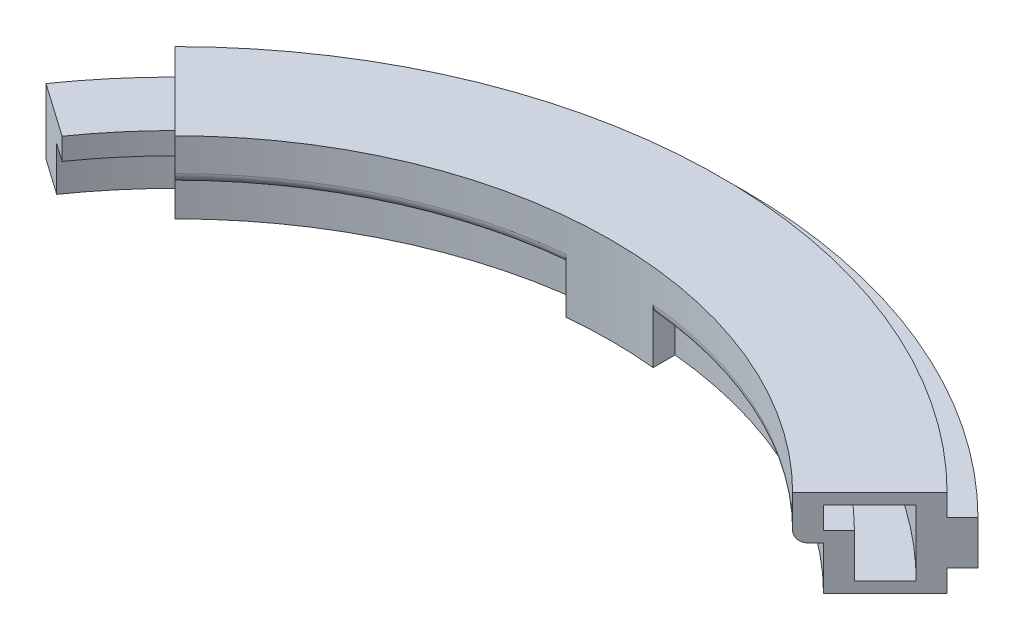
ISO-10303-21;
HEADER;
FILE_DESCRIPTION(('STEP AP214'),'2;1');
FILE_NAME('part.step','',(''),(''),'','','');
FILE_SCHEMA(('AUTOMOTIVE_DESIGN { 1 0 10303 214 1 1 1 1 }'));
ENDSEC;
DATA;
#1=APPLICATION_CONTEXT('core data for automotive mechanical design processes');
#2=APPLICATION_PROTOCOL_DEFINITION('international standard','automotive_design',2000,#1);
#3=PRODUCT_CONTEXT('',#1,'mechanical');
#4=PRODUCT('Part','Part','',(#3));
#5=PRODUCT_RELATED_PRODUCT_CATEGORY('part','',(#4));
#6=PRODUCT_DEFINITION_FORMATION('','',#4);
#7=PRODUCT_DEFINITION_CONTEXT('part definition',#1,'design');
#8=PRODUCT_DEFINITION('design','',#6,#7);
#9=PRODUCT_DEFINITION_SHAPE('','',#8);
#10=(LENGTH_UNIT() NAMED_UNIT(*) SI_UNIT(.MILLI.,.METRE.));
#11=(NAMED_UNIT(*) PLANE_ANGLE_UNIT() SI_UNIT($,.RADIAN.));
#12=(NAMED_UNIT(*) SI_UNIT($,.STERADIAN.) SOLID_ANGLE_UNIT());
#13=UNCERTAINTY_MEASURE_WITH_UNIT(LENGTH_MEASURE(1.E-05),#10,'distance_accuracy_value','');
#14=(GEOMETRIC_REPRESENTATION_CONTEXT(3) GLOBAL_UNCERTAINTY_ASSIGNED_CONTEXT((#13)) GLOBAL_UNIT_ASSIGNED_CONTEXT((#10,
#11,#12)) REPRESENTATION_CONTEXT('',''));
#15=CARTESIAN_POINT('',(0.,0.,0.));
#16=DIRECTION('',(0.,0.,1.));
#17=DIRECTION('',(1.,0.,0.));
#18=AXIS2_PLACEMENT_3D('',#15,#16,#17);
#19=CARTESIAN_POINT('',(0.,10.,0.));
#20=DIRECTION('',(0.,-1.,0.));
#21=DIRECTION('',(0.,0.,-1.));
#22=AXIS2_PLACEMENT_3D('',#19,#20,#21);
#23=CYLINDRICAL_SURFACE('',#22,125.);
#24=CARTESIAN_POINT('',(0.,5.00000000000001,0.));
#25=DIRECTION('',(0.,1.,0.));
#26=DIRECTION('',(0.,0.,1.));
#27=AXIS2_PLACEMENT_3D('',#24,#25,#26);
#28=CIRCLE('',#27,125.);
#29=CARTESIAN_POINT('',(88.3883476483183,5.00000000000001,-88.3883476483186));
#30=VERTEX_POINT('',#29);
#31=CARTESIAN_POINT('',(-88.3883476483189,5.00000000000001,-88.388347648318));
#32=VERTEX_POINT('',#31);
#33=EDGE_CURVE('E236',#30,#32,#28,.T.);
#34=ORIENTED_EDGE('',*,*,#33,.F.);
#35=DIRECTION('',(0.,-1.,0.));
#36=VECTOR('',#35,1.);
#37=CARTESIAN_POINT('',(88.3883476483189,10.,-88.388347648318));
#38=LINE('',#37,#36);
#39=CARTESIAN_POINT('',(88.3883476483189,0.,-88.388347648318));
#40=VERTEX_POINT('',#39);
#41=EDGE_CURVE('E420',#30,#40,#38,.T.);
#42=ORIENTED_EDGE('',*,*,#41,.T.);
#43=CARTESIAN_POINT('',(0.,0.,0.));
#44=DIRECTION('',(0.,1.,0.));
#45=DIRECTION('',(0.,0.,1.));
#46=AXIS2_PLACEMENT_3D('',#43,#44,#45);
#47=CIRCLE('',#46,125.);
#48=CARTESIAN_POINT('',(-88.3883476483189,0.,-88.388347648318));
#49=VERTEX_POINT('',#48);
#50=EDGE_CURVE('E410',#40,#49,#47,.T.);
#51=ORIENTED_EDGE('',*,*,#50,.T.);
#52=DIRECTION('',(0.,-1.,0.));
#53=VECTOR('',#52,1.);
#54=CARTESIAN_POINT('',(-88.3883476483189,10.,-88.388347648318));
#55=LINE('',#54,#53);
#56=EDGE_CURVE('E417',#32,#49,#55,.T.);
#57=ORIENTED_EDGE('',*,*,#56,.F.);
#58=EDGE_LOOP('',(#34,#42,#51,#57));
#59=FACE_BOUND('',#58,.T.);
#60=ADVANCED_FACE('F36',(#59),#23,.T.);
#61=CARTESIAN_POINT('',(0.,10.,0.));
#62=DIRECTION('',(-0.707106781186544,0.,-0.707106781186551));
#63=DIRECTION('',(-0.707106781186551,0.,0.707106781186544));
#64=AXIS2_PLACEMENT_3D('',#61,#62,#63);
#65=PLANE('',#64);
#66=DIRECTION('',(0.,-1.,0.));
#67=VECTOR('',#66,1.);
#68=CARTESIAN_POINT('',(70.7106781186551,20.,-70.7106781186544));
#69=LINE('',#68,#67);
#70=CARTESIAN_POINT('',(70.7106781186551,20.,-70.7106781186544));
#71=VERTEX_POINT('',#70);
#72=CARTESIAN_POINT('',(70.7106781186551,12.5,-70.7106781186544));
#73=VERTEX_POINT('',#72);
#74=EDGE_CURVE('E377',#71,#73,#69,.T.);
#75=ORIENTED_EDGE('',*,*,#74,.T.);
#76=CARTESIAN_POINT('',(72.4784450716215,12.5,-72.4784450716208));
#77=DIRECTION('',(-0.707106781186544,0.,-0.707106781186551));
#78=DIRECTION('',(-0.707106781186551,0.,0.707106781186544));
#79=AXIS2_PLACEMENT_3D('',#76,#77,#78);
#80=CIRCLE('',#79,2.5);
#81=CARTESIAN_POINT('',(72.4784450716215,10.,-72.4784450716208));
#82=VERTEX_POINT('',#81);
#83=EDGE_CURVE('E65',#73,#82,#80,.F.);
#84=ORIENTED_EDGE('',*,*,#83,.T.);
#85=DIRECTION('',(0.707106781186551,0.,-0.707106781186544));
#86=VECTOR('',#85,1.);
#87=CARTESIAN_POINT('',(0.,10.,0.));
#88=LINE('',#87,#86);
#89=CARTESIAN_POINT('',(74.2462120245878,10.,-74.2462120245872));
#90=VERTEX_POINT('',#89);
#91=EDGE_CURVE('E369',#82,#90,#88,.T.);
#92=ORIENTED_EDGE('',*,*,#91,.T.);
#93=DIRECTION('',(0.,-1.,0.));
#94=VECTOR('',#93,1.);
#95=CARTESIAN_POINT('',(74.2462120245878,10.,-74.2462120245872));
#96=LINE('',#95,#94);
#97=CARTESIAN_POINT('',(74.2462120245878,0.,-74.2462120245872));
#98=VERTEX_POINT('',#97);
#99=EDGE_CURVE('E424',#90,#98,#96,.T.);
#100=ORIENTED_EDGE('',*,*,#99,.T.);
#101=DIRECTION('',(0.707106781186551,0.,-0.707106781186544));
#102=VECTOR('',#101,1.);
#103=CARTESIAN_POINT('',(0.,0.,0.));
#104=LINE('',#103,#102);
#105=EDGE_CURVE('E407',#98,#40,#104,.T.);
#106=ORIENTED_EDGE('',*,*,#105,.T.);
#107=ORIENTED_EDGE('',*,*,#41,.F.);
#108=DIRECTION('',(0.707106781186546,0.,-0.707106781186549));
#109=VECTOR('',#108,1.);
#110=CARTESIAN_POINT('',(0.,5.00000000000002,0.));
#111=LINE('',#110,#109);
#112=CARTESIAN_POINT('',(91.923881554251,5.00000000000001,-91.9238815542513));
#113=VERTEX_POINT('',#112);
#114=EDGE_CURVE('E256',#30,#113,#111,.T.);
#115=ORIENTED_EDGE('',*,*,#114,.T.);
#116=DIRECTION('',(0.,1.,0.));
#117=VECTOR('',#116,1.);
#118=CARTESIAN_POINT('',(91.923881554251,0.,-91.9238815542513));
#119=LINE('',#118,#117);
#120=CARTESIAN_POINT('',(91.923881554251,15.,-91.9238815542513));
#121=VERTEX_POINT('',#120);
#122=EDGE_CURVE('E233',#113,#121,#119,.T.);
#123=ORIENTED_EDGE('',*,*,#122,.T.);
#124=DIRECTION('',(0.707106781186546,0.,-0.707106781186549));
#125=VECTOR('',#124,1.);
#126=CARTESIAN_POINT('',(0.,15.,0.));
#127=LINE('',#126,#125);
#128=CARTESIAN_POINT('',(88.3883476483183,15.,-88.3883476483186));
#129=VERTEX_POINT('',#128);
#130=EDGE_CURVE('E237',#129,#121,#127,.T.);
#131=ORIENTED_EDGE('',*,*,#130,.F.);
#132=CARTESIAN_POINT('',(88.3883476483188,20.,-88.388347648318));
#133=VERTEX_POINT('',#132);
#134=EDGE_CURVE('E421',#133,#129,#38,.T.);
#135=ORIENTED_EDGE('',*,*,#134,.F.);
#136=DIRECTION('',(0.707106781186551,0.,-0.707106781186544));
#137=VECTOR('',#136,1.);
#138=CARTESIAN_POINT('',(0.,20.,0.));
#139=LINE('',#138,#137);
#140=EDGE_CURVE('E371',#71,#133,#139,.T.);
#141=ORIENTED_EDGE('',*,*,#140,.F.);
#142=EDGE_LOOP('',(#75,#84,#92,#100,#106,#107,#115,#123,#131,#135,#141));
#143=FACE_BOUND('',#142,.T.);
#144=DIRECTION('',(0.,-1.,0.));
#145=VECTOR('',#144,1.);
#146=CARTESIAN_POINT('',(84.8528137423861,0.,-84.8528137423853));
#147=LINE('',#146,#145);
#148=CARTESIAN_POINT('',(84.8528137423861,17.5,-84.8528137423853));
#149=VERTEX_POINT('',#148);
#150=CARTESIAN_POINT('',(84.8528137423861,2.5,-84.8528137423853));
#151=VERTEX_POINT('',#150);
#152=EDGE_CURVE('E266',#149,#151,#147,.T.);
#153=ORIENTED_EDGE('',*,*,#152,.T.);
#154=DIRECTION('',(0.707106781186551,0.,-0.707106781186544));
#155=VECTOR('',#154,1.);
#156=CARTESIAN_POINT('',(0.,2.5,0.));
#157=LINE('',#156,#155);
#158=CARTESIAN_POINT('',(77.7817459305206,2.5,-77.7817459305199));
#159=VERTEX_POINT('',#158);
#160=EDGE_CURVE('E281',#159,#151,#157,.T.);
#161=ORIENTED_EDGE('',*,*,#160,.F.);
#162=DIRECTION('',(0.,-1.,0.));
#163=VECTOR('',#162,1.);
#164=CARTESIAN_POINT('',(77.7817459305206,0.,-77.7817459305199));
#165=LINE('',#164,#163);
#166=CARTESIAN_POINT('',(77.7817459305206,12.5,-77.7817459305199));
#167=VERTEX_POINT('',#166);
#168=EDGE_CURVE('E278',#167,#159,#165,.T.);
#169=ORIENTED_EDGE('',*,*,#168,.F.);
#170=DIRECTION('',(0.707106781186551,0.,-0.707106781186544));
#171=VECTOR('',#170,1.);
#172=CARTESIAN_POINT('',(0.,12.5,0.));
#173=LINE('',#172,#171);
#174=CARTESIAN_POINT('',(74.2462120245878,12.5,-74.2462120245872));
#175=VERTEX_POINT('',#174);
#176=EDGE_CURVE('E275',#175,#167,#173,.T.);
#177=ORIENTED_EDGE('',*,*,#176,.F.);
#178=DIRECTION('',(0.,-1.,0.));
#179=VECTOR('',#178,1.);
#180=CARTESIAN_POINT('',(74.2462120245878,0.,-74.2462120245872));
#181=LINE('',#180,#179);
#182=CARTESIAN_POINT('',(74.2462120245878,17.5,-74.2462120245872));
#183=VERTEX_POINT('',#182);
#184=EDGE_CURVE('E272',#183,#175,#181,.T.);
#185=ORIENTED_EDGE('',*,*,#184,.F.);
#186=DIRECTION('',(0.707106781186551,0.,-0.707106781186544));
#187=VECTOR('',#186,1.);
#188=CARTESIAN_POINT('',(0.,17.5,0.));
#189=LINE('',#188,#187);
#190=EDGE_CURVE('E269',#183,#149,#189,.T.);
#191=ORIENTED_EDGE('',*,*,#190,.T.);
#192=EDGE_LOOP('',(#153,#161,#169,#177,#185,#191));
#193=FACE_BOUND('',#192,.T.);
#194=ADVANCED_FACE('F466',(#143,#193),#65,.F.);
#195=CARTESIAN_POINT('',(0.,10.,0.));
#196=DIRECTION('',(-0.707106781186544,0.,0.707106781186551));
#197=DIRECTION('',(0.707106781186551,0.,0.707106781186544));
#198=AXIS2_PLACEMENT_3D('',#195,#196,#197);
#199=PLANE('',#198);
#200=DIRECTION('',(0.707106781186551,0.,0.707106781186544));
#201=VECTOR('',#200,1.);
#202=CARTESIAN_POINT('',(0.,10.,0.));
#203=LINE('',#202,#201);
#204=CARTESIAN_POINT('',(-74.2462120245879,10.,-74.2462120245871));
#205=VERTEX_POINT('',#204);
#206=CARTESIAN_POINT('',(-72.4784450716215,10.,-72.4784450716208));
#207=VERTEX_POINT('',#206);
#208=EDGE_CURVE('E364',#205,#207,#203,.T.);
#209=ORIENTED_EDGE('',*,*,#208,.T.);
#210=CARTESIAN_POINT('',(-72.4784450716215,12.5,-72.4784450716207));
#211=DIRECTION('',(-0.707106781186544,0.,0.707106781186551));
#212=DIRECTION('',(0.707106781186551,0.,0.707106781186544));
#213=AXIS2_PLACEMENT_3D('',#210,#211,#212);
#214=CIRCLE('',#213,2.5);
#215=CARTESIAN_POINT('',(-70.7106781186551,12.5,-70.7106781186544));
#216=VERTEX_POINT('',#215);
#217=EDGE_CURVE('E442',#207,#216,#214,.T.);
#218=ORIENTED_EDGE('',*,*,#217,.T.);
#219=DIRECTION('',(0.,-1.,0.));
#220=VECTOR('',#219,1.);
#221=CARTESIAN_POINT('',(-70.7106781186551,20.,-70.7106781186544));
#222=LINE('',#221,#220);
#223=CARTESIAN_POINT('',(-70.7106781186551,20.,-70.7106781186544));
#224=VERTEX_POINT('',#223);
#225=EDGE_CURVE('E381',#224,#216,#222,.T.);
#226=ORIENTED_EDGE('',*,*,#225,.F.);
#227=DIRECTION('',(0.707106781186551,0.,0.707106781186544));
#228=VECTOR('',#227,1.);
#229=CARTESIAN_POINT('',(0.,20.,0.));
#230=LINE('',#229,#228);
#231=CARTESIAN_POINT('',(-88.3883476483189,20.,-88.388347648318));
#232=VERTEX_POINT('',#231);
#233=EDGE_CURVE('E365',#232,#224,#230,.T.);
#234=ORIENTED_EDGE('',*,*,#233,.F.);
#235=CARTESIAN_POINT('',(-88.3883476483189,15.,-88.388347648318));
#236=VERTEX_POINT('',#235);
#237=EDGE_CURVE('E418',#232,#236,#55,.T.);
#238=ORIENTED_EDGE('',*,*,#237,.T.);
#239=DIRECTION('',(-0.707106781186551,0.,-0.707106781186544));
#240=VECTOR('',#239,1.);
#241=CARTESIAN_POINT('',(0.,15.,0.));
#242=LINE('',#241,#240);
#243=CARTESIAN_POINT('',(-91.9238815542517,15.,-91.9238815542507));
#244=VERTEX_POINT('',#243);
#245=EDGE_CURVE('E245',#236,#244,#242,.T.);
#246=ORIENTED_EDGE('',*,*,#245,.T.);
#247=DIRECTION('',(0.,1.,0.));
#248=VECTOR('',#247,1.);
#249=CARTESIAN_POINT('',(-91.9238815542517,0.,-91.9238815542507));
#250=LINE('',#249,#248);
#251=CARTESIAN_POINT('',(-91.9238815542517,5.00000000000001,-91.9238815542507));
#252=VERTEX_POINT('',#251);
#253=EDGE_CURVE('E231',#252,#244,#250,.T.);
#254=ORIENTED_EDGE('',*,*,#253,.F.);
#255=DIRECTION('',(-0.707106781186551,0.,-0.707106781186544));
#256=VECTOR('',#255,1.);
#257=CARTESIAN_POINT('',(0.,5.00000000000002,0.));
#258=LINE('',#257,#256);
#259=EDGE_CURVE('E240',#32,#252,#258,.T.);
#260=ORIENTED_EDGE('',*,*,#259,.F.);
#261=ORIENTED_EDGE('',*,*,#56,.T.);
#262=DIRECTION('',(-0.707106781186551,0.,-0.707106781186544));
#263=VECTOR('',#262,1.);
#264=CARTESIAN_POINT('',(0.,0.,0.));
#265=LINE('',#264,#263);
#266=CARTESIAN_POINT('',(-74.2462120245879,0.,-74.2462120245871));
#267=VERTEX_POINT('',#266);
#268=EDGE_CURVE('E389',#267,#49,#265,.T.);
#269=ORIENTED_EDGE('',*,*,#268,.F.);
#270=DIRECTION('',(0.,-1.,0.));
#271=VECTOR('',#270,1.);
#272=CARTESIAN_POINT('',(-74.2462120245879,10.,-74.2462120245871));
#273=LINE('',#272,#271);
#274=EDGE_CURVE('E415',#205,#267,#273,.T.);
#275=ORIENTED_EDGE('',*,*,#274,.F.);
#276=EDGE_LOOP('',(#209,#218,#226,#234,#238,#246,#254,#260,#261,#269,#275));
#277=FACE_BOUND('',#276,.T.);
#278=DIRECTION('',(0.707106781186551,0.,0.707106781186544));
#279=VECTOR('',#278,1.);
#280=CARTESIAN_POINT('',(0.,17.5,0.));
#281=LINE('',#280,#279);
#282=CARTESIAN_POINT('',(-84.8528137423862,17.5,-84.8528137423853));
#283=VERTEX_POINT('',#282);
#284=CARTESIAN_POINT('',(-74.2462120245879,17.5,-74.2462120245871));
#285=VERTEX_POINT('',#284);
#286=EDGE_CURVE('E318',#283,#285,#281,.T.);
#287=ORIENTED_EDGE('',*,*,#286,.T.);
#288=DIRECTION('',(0.,-1.,0.));
#289=VECTOR('',#288,1.);
#290=CARTESIAN_POINT('',(-74.2462120245879,0.,-74.2462120245871));
#291=LINE('',#290,#289);
#292=CARTESIAN_POINT('',(-74.2462120245879,12.5,-74.2462120245871));
#293=VERTEX_POINT('',#292);
#294=EDGE_CURVE('E315',#285,#293,#291,.T.);
#295=ORIENTED_EDGE('',*,*,#294,.T.);
#296=DIRECTION('',(0.707106781186551,0.,0.707106781186544));
#297=VECTOR('',#296,1.);
#298=CARTESIAN_POINT('',(0.,12.5,0.));
#299=LINE('',#298,#297);
#300=CARTESIAN_POINT('',(-77.7817459305207,12.5,-77.7817459305198));
#301=VERTEX_POINT('',#300);
#302=EDGE_CURVE('E330',#301,#293,#299,.T.);
#303=ORIENTED_EDGE('',*,*,#302,.F.);
#304=DIRECTION('',(0.,-1.,0.));
#305=VECTOR('',#304,1.);
#306=CARTESIAN_POINT('',(-77.7817459305207,0.,-77.7817459305198));
#307=LINE('',#306,#305);
#308=CARTESIAN_POINT('',(-77.7817459305207,2.5,-77.7817459305198));
#309=VERTEX_POINT('',#308);
#310=EDGE_CURVE('E327',#301,#309,#307,.T.);
#311=ORIENTED_EDGE('',*,*,#310,.T.);
#312=DIRECTION('',(0.707106781186551,0.,0.707106781186544));
#313=VECTOR('',#312,1.);
#314=CARTESIAN_POINT('',(0.,2.5,0.));
#315=LINE('',#314,#313);
#316=CARTESIAN_POINT('',(-84.8528137423862,2.5,-84.8528137423853));
#317=VERTEX_POINT('',#316);
#318=EDGE_CURVE('E324',#317,#309,#315,.T.);
#319=ORIENTED_EDGE('',*,*,#318,.F.);
#320=DIRECTION('',(0.,-1.,0.));
#321=VECTOR('',#320,1.);
#322=CARTESIAN_POINT('',(-84.8528137423862,0.,-84.8528137423853));
#323=LINE('',#322,#321);
#324=EDGE_CURVE('E321',#283,#317,#323,.T.);
#325=ORIENTED_EDGE('',*,*,#324,.F.);
#326=EDGE_LOOP('',(#287,#295,#303,#311,#319,#325));
#327=FACE_BOUND('',#326,.T.);
#328=ADVANCED_FACE('F249',(#277,#327),#199,.T.);
#329=CARTESIAN_POINT('',(0.,10.,0.));
#330=DIRECTION('',(0.,-1.,0.));
#331=DIRECTION('',(0.,0.,-1.));
#332=AXIS2_PLACEMENT_3D('',#329,#330,#331);
#333=CYLINDRICAL_SURFACE('',#332,105.);
#334=CARTESIAN_POINT('',(0.,0.,0.));
#335=DIRECTION('',(0.,1.,0.));
#336=DIRECTION('',(0.,0.,1.));
#337=AXIS2_PLACEMENT_3D('',#334,#335,#336);
#338=CIRCLE('',#337,105.);
#339=CARTESIAN_POINT('',(-10.,0.,-104.522724801834));
#340=VERTEX_POINT('',#339);
#341=EDGE_CURVE('E384',#340,#267,#338,.T.);
#342=ORIENTED_EDGE('',*,*,#341,.F.);
#343=DIRECTION('',(0.,-1.,0.));
#344=VECTOR('',#343,1.);
#345=CARTESIAN_POINT('',(-10.,10.,-104.522724801834));
#346=LINE('',#345,#344);
#347=CARTESIAN_POINT('',(-10.,10.,-104.522724801834));
#348=VERTEX_POINT('',#347);
#349=EDGE_CURVE('E432',#348,#340,#346,.T.);
#350=ORIENTED_EDGE('',*,*,#349,.F.);
#351=CARTESIAN_POINT('',(0.,10.,0.));
#352=DIRECTION('',(0.,1.,0.));
#353=DIRECTION('',(0.,0.,1.));
#354=AXIS2_PLACEMENT_3D('',#351,#352,#353);
#355=CIRCLE('',#354,105.);
#356=EDGE_CURVE('E385',#348,#205,#355,.T.);
#357=ORIENTED_EDGE('',*,*,#356,.T.);
#358=ORIENTED_EDGE('',*,*,#274,.T.);
#359=EDGE_LOOP('',(#342,#350,#357,#358));
#360=FACE_BOUND('',#359,.T.);
#361=ADVANCED_FACE('F489',(#360),#333,.F.);
#362=CARTESIAN_POINT('',(-10.,10.,0.));
#363=DIRECTION('',(1.,0.,0.));
#364=DIRECTION('',(0.,0.,-1.));
#365=AXIS2_PLACEMENT_3D('',#362,#363,#364);
#366=PLANE('',#365);
#367=DIRECTION('',(0.,0.,1.));
#368=VECTOR('',#367,1.);
#369=CARTESIAN_POINT('',(-10.,0.,0.));
#370=LINE('',#369,#368);
#371=CARTESIAN_POINT('',(-10.,0.,-99.498743710662));
#372=VERTEX_POINT('',#371);
#373=EDGE_CURVE('E397',#340,#372,#370,.T.);
#374=ORIENTED_EDGE('',*,*,#373,.T.);
#375=DIRECTION('',(0.,-1.,0.));
#376=VECTOR('',#375,1.);
#377=CARTESIAN_POINT('',(-10.,10.,-99.498743710662));
#378=LINE('',#377,#376);
#379=CARTESIAN_POINT('',(-10.,12.5,-99.498743710662));
#380=VERTEX_POINT('',#379);
#381=EDGE_CURVE('E430',#380,#372,#378,.T.);
#382=ORIENTED_EDGE('',*,*,#381,.F.);
#383=CARTESIAN_POINT('',(-10.,12.5,-99.498743710662));
#384=CARTESIAN_POINT('',(-10.,12.4299376288661,-99.4987367437487));
#385=CARTESIAN_POINT('',(-10.,12.3598785642402,-99.5017037535327));
#386=CARTESIAN_POINT('',(-10.,12.2202637076876,-99.5135318597869));
#387=CARTESIAN_POINT('',(-10.,12.1507078867071,-99.5223926132045));
#388=CARTESIAN_POINT('',(-10.,12.0126499675776,-99.5459437648455));
#389=CARTESIAN_POINT('',(-10.,11.9441469786748,-99.5606289171214));
#390=CARTESIAN_POINT('',(-10.,11.8086386653625,-99.5957065313998));
#391=CARTESIAN_POINT('',(-10.,11.7416333256215,-99.6160989349481));
#392=CARTESIAN_POINT('',(-10.,11.5435161526823,-99.6856637719187));
#393=CARTESIAN_POINT('',(-10.,11.4152397643948,-99.7432347123815));
#394=CARTESIAN_POINT('',(-10.,11.1702339362793,-99.8790116035102));
#395=CARTESIAN_POINT('',(-10.,11.0535029400136,-99.9572147675126));
#396=CARTESIAN_POINT('',(-10.,10.8344873208769,-100.13222759103));
#397=CARTESIAN_POINT('',(-10.,10.7322355700957,-100.229078447064));
#398=CARTESIAN_POINT('',(-10.,10.5453356658326,-100.438519610936));
#399=CARTESIAN_POINT('',(-10.,10.4606911306205,-100.551113145949));
#400=CARTESIAN_POINT('',(-10.,10.3109886003593,-100.789405261061));
#401=CARTESIAN_POINT('',(-10.,10.2460286766255,-100.915165390691));
#402=CARTESIAN_POINT('',(-10.,10.1380717738887,-101.17575181468));
#403=CARTESIAN_POINT('',(-10.,10.0950633969986,-101.310573362844));
#404=CARTESIAN_POINT('',(-10.,10.0424732149119,-101.540296915153));
#405=CARTESIAN_POINT('',(-10.,10.0265556676133,-101.633798660994));
#406=CARTESIAN_POINT('',(-10.,10.0053200827558,-101.821863971923));
#407=CARTESIAN_POINT('',(-10.,9.999987094611,-101.916425849319));
#408=CARTESIAN_POINT('',(-10.,10.,-102.011028815516));
#409=B_SPLINE_CURVE_WITH_KNOTS('',3,(#383,#384,#385,#386,#387,#388,#389,#390,#391,#392,#393,
#394,#395,#396,#397,#398,#399,#400,#401,#402,#403,#404,#405,#406,#407,#408),.UNSPECIFIED.,.F.,
.F.,(4,2,2,2,2,2,2,2,2,2,2,2,4),(0.,0.210118379807878,0.420224530484143,0.630141869928581,
0.840057059458299,1.25969688481256,1.67928006106975,2.0998010435041,2.52040835750229,
2.94307798547745,3.36552792715305,3.64950813413663,3.93308693558742),.UNSPECIFIED.);
#410=CARTESIAN_POINT('',(-10.,10.,-102.011028815516));
#411=VERTEX_POINT('',#410);
#412=EDGE_CURVE('E50',#380,#411,#409,.T.);
#413=ORIENTED_EDGE('',*,*,#412,.T.);
#414=DIRECTION('',(0.,0.,1.));
#415=VECTOR('',#414,1.);
#416=CARTESIAN_POINT('',(-10.,10.,0.));
#417=LINE('',#416,#415);
#418=EDGE_CURVE('E388',#348,#411,#417,.T.);
#419=ORIENTED_EDGE('',*,*,#418,.F.);
#420=ORIENTED_EDGE('',*,*,#349,.T.);
#421=EDGE_LOOP('',(#374,#382,#413,#419,#420));
#422=FACE_BOUND('',#421,.T.);
#423=ADVANCED_FACE('F450',(#422),#366,.F.);
#424=CARTESIAN_POINT('',(0.,10.,0.));
#425=DIRECTION('',(0.,-1.,0.));
#426=DIRECTION('',(0.,0.,-1.));
#427=AXIS2_PLACEMENT_3D('',#424,#425,#426);
#428=CYLINDRICAL_SURFACE('',#427,100.);
#429=ORIENTED_EDGE('',*,*,#225,.T.);
#430=CARTESIAN_POINT('',(0.,12.5,0.));
#431=DIRECTION('',(0.,1.,0.));
#432=DIRECTION('',(0.,0.,1.));
#433=AXIS2_PLACEMENT_3D('',#430,#431,#432);
#434=CIRCLE('',#433,100.);
#435=EDGE_CURVE('E437',#216,#380,#434,.F.);
#436=ORIENTED_EDGE('',*,*,#435,.T.);
#437=ORIENTED_EDGE('',*,*,#381,.T.);
#438=CARTESIAN_POINT('',(0.,0.,0.));
#439=DIRECTION('',(0.,1.,0.));
#440=DIRECTION('',(0.,0.,1.));
#441=AXIS2_PLACEMENT_3D('',#438,#439,#440);
#442=CIRCLE('',#441,100.);
#443=CARTESIAN_POINT('',(9.99999999999999,0.,-99.498743710662));
#444=VERTEX_POINT('',#443);
#445=EDGE_CURVE('E401',#444,#372,#442,.T.);
#446=ORIENTED_EDGE('',*,*,#445,.F.);
#447=DIRECTION('',(0.,-1.,0.));
#448=VECTOR('',#447,1.);
#449=CARTESIAN_POINT('',(9.99999999999999,10.,-99.498743710662));
#450=LINE('',#449,#448);
#451=CARTESIAN_POINT('',(9.99999999999999,12.5,-99.498743710662));
#452=VERTEX_POINT('',#451);
#453=EDGE_CURVE('E428',#452,#444,#450,.T.);
#454=ORIENTED_EDGE('',*,*,#453,.F.);
#455=CARTESIAN_POINT('',(0.,12.5,0.));
#456=DIRECTION('',(0.,1.,0.));
#457=DIRECTION('',(0.,0.,1.));
#458=AXIS2_PLACEMENT_3D('',#455,#456,#457);
#459=CIRCLE('',#458,100.);
#460=EDGE_CURVE('E434',#452,#73,#459,.F.);
#461=ORIENTED_EDGE('',*,*,#460,.T.);
#462=ORIENTED_EDGE('',*,*,#74,.F.);
#463=CARTESIAN_POINT('',(0.,20.,0.));
#464=DIRECTION('',(0.,1.,0.));
#465=DIRECTION('',(0.,0.,1.));
#466=AXIS2_PLACEMENT_3D('',#463,#464,#465);
#467=CIRCLE('',#466,100.);
#468=EDGE_CURVE('E368',#224,#71,#467,.F.);
#469=ORIENTED_EDGE('',*,*,#468,.F.);
#470=EDGE_LOOP('',(#429,#436,#437,#446,#454,#461,#462,#469));
#471=FACE_BOUND('',#470,.T.);
#472=ADVANCED_FACE('F500',(#471),#428,.F.);
#473=CARTESIAN_POINT('',(10.,10.,0.));
#474=DIRECTION('',(1.,0.,0.));
#475=DIRECTION('',(0.,0.,-1.));
#476=AXIS2_PLACEMENT_3D('',#473,#474,#475);
#477=PLANE('',#476);
#478=DIRECTION('',(0.,0.,1.));
#479=VECTOR('',#478,1.);
#480=CARTESIAN_POINT('',(10.,0.,0.));
#481=LINE('',#480,#479);
#482=CARTESIAN_POINT('',(9.99999999999999,0.,-104.522724801834));
#483=VERTEX_POINT('',#482);
#484=EDGE_CURVE('E404',#483,#444,#481,.T.);
#485=ORIENTED_EDGE('',*,*,#484,.F.);
#486=DIRECTION('',(0.,-1.,0.));
#487=VECTOR('',#486,1.);
#488=CARTESIAN_POINT('',(9.99999999999999,10.,-104.522724801834));
#489=LINE('',#488,#487);
#490=CARTESIAN_POINT('',(9.99999999999999,10.,-104.522724801834));
#491=VERTEX_POINT('',#490);
#492=EDGE_CURVE('E426',#491,#483,#489,.T.);
#493=ORIENTED_EDGE('',*,*,#492,.F.);
#494=DIRECTION('',(0.,0.,1.));
#495=VECTOR('',#494,1.);
#496=CARTESIAN_POINT('',(10.,10.,0.));
#497=LINE('',#496,#495);
#498=CARTESIAN_POINT('',(9.99999999999999,10.,-102.011028815516));
#499=VERTEX_POINT('',#498);
#500=EDGE_CURVE('E393',#491,#499,#497,.T.);
#501=ORIENTED_EDGE('',*,*,#500,.T.);
#502=CARTESIAN_POINT('',(9.99999999999999,10.,-102.011028815516));
#503=CARTESIAN_POINT('',(9.99999999999999,9.99999344621008,-101.940117160367));
#504=CARTESIAN_POINT('',(9.99999999999999,10.0029883473859,-101.869208641098));
#505=CARTESIAN_POINT('',(9.99999999999999,10.0149299202468,-101.727897239252));
#506=CARTESIAN_POINT('',(9.99999999999999,10.0238763573945,-101.65749433686));
#507=CARTESIAN_POINT('',(9.99999999999999,10.0476624632689,-101.517731389175));
#508=CARTESIAN_POINT('',(9.99999999999999,10.06249845935,-101.44837072188));
#509=CARTESIAN_POINT('',(9.99999999999999,10.0979461092966,-101.311162291323));
#510=CARTESIAN_POINT('',(9.99999999999999,10.1185576838376,-101.243314507295));
#511=CARTESIAN_POINT('',(9.99999999999999,10.1888967283383,-101.042690178555));
#512=CARTESIAN_POINT('',(9.99999999999999,10.247137198857,-100.912781897398));
#513=CARTESIAN_POINT('',(9.99999999999999,10.3846049605745,-100.664713218597));
#514=CARTESIAN_POINT('',(9.99999999999999,10.4638277873057,-100.546550329202));
#515=CARTESIAN_POINT('',(9.99999999999999,10.6408864424883,-100.325481760081));
#516=CARTESIAN_POINT('',(9.99999999999999,10.7386833950513,-100.222544998389));
#517=CARTESIAN_POINT('',(9.99999999999999,10.9502644219467,-100.03462767655));
#518=CARTESIAN_POINT('',(9.99999999999999,11.064051457129,-99.9496504492466));
#519=CARTESIAN_POINT('',(9.99999999999999,11.3038142552071,-99.8004934594308));
#520=CARTESIAN_POINT('',(9.99999999999999,11.4297339900261,-99.7362235372453));
#521=CARTESIAN_POINT('',(9.99999999999999,11.6905820053321,-99.6298816832663));
#522=CARTESIAN_POINT('',(9.99999999999999,11.8255043019309,-99.587795168812));
#523=CARTESIAN_POINT('',(9.99999999999999,12.0510988706043,-99.5379121106181));
#524=CARTESIAN_POINT('',(9.99999999999999,12.1403086893246,-99.5232328008713));
#525=CARTESIAN_POINT('',(9.99999999999999,12.3196660538147,-99.5036502210427));
#526=CARTESIAN_POINT('',(9.99999999999999,12.4098120837549,-99.4987330628433));
#527=CARTESIAN_POINT('',(9.99999999999999,12.5,-99.498743710662));
#528=B_SPLINE_CURVE_WITH_KNOTS('',3,(#502,#503,#504,#505,#506,#507,#508,#509,#510,#511,#512,
#513,#514,#515,#516,#517,#518,#519,#520,#521,#522,#523,#524,#525,#526,#527),.UNSPECIFIED.,.F.,
.F.,(4,2,2,2,2,2,2,2,2,2,2,2,4),(0.,0.212666070126113,0.42532376003385,0.637849047406157,
0.850371416004172,1.27526360966707,1.70006547049843,2.12398782298132,2.5479887759606,
2.97011786495198,3.39196911264407,3.66270274255839,3.93305093669019),.UNSPECIFIED.);
#529=EDGE_CURVE('E11',#499,#452,#528,.T.);
#530=ORIENTED_EDGE('',*,*,#529,.T.);
#531=ORIENTED_EDGE('',*,*,#453,.T.);
#532=EDGE_LOOP('',(#485,#493,#501,#530,#531));
#533=FACE_BOUND('',#532,.T.);
#534=ADVANCED_FACE('F486',(#533),#477,.T.);
#535=EDGE_CURVE('E398',#98,#483,#338,.T.);
#536=ORIENTED_EDGE('',*,*,#535,.F.);
#537=ORIENTED_EDGE('',*,*,#99,.F.);
#538=EDGE_CURVE('E390',#90,#491,#355,.T.);
#539=ORIENTED_EDGE('',*,*,#538,.T.);
#540=ORIENTED_EDGE('',*,*,#492,.T.);
#541=EDGE_LOOP('',(#536,#537,#539,#540));
#542=FACE_BOUND('',#541,.T.);
#543=ADVANCED_FACE('F477',(#542),#333,.F.);
#544=ORIENTED_EDGE('',*,*,#134,.T.);
#545=CARTESIAN_POINT('',(0.,15.,0.));
#546=DIRECTION('',(0.,1.,0.));
#547=DIRECTION('',(0.,0.,1.));
#548=AXIS2_PLACEMENT_3D('',#545,#546,#547);
#549=CIRCLE('',#548,125.);
#550=EDGE_CURVE('E261',#129,#236,#549,.T.);
#551=ORIENTED_EDGE('',*,*,#550,.T.);
#552=ORIENTED_EDGE('',*,*,#237,.F.);
#553=CARTESIAN_POINT('',(0.,20.,0.));
#554=DIRECTION('',(0.,1.,0.));
#555=DIRECTION('',(0.,0.,1.));
#556=AXIS2_PLACEMENT_3D('',#553,#554,#555);
#557=CIRCLE('',#556,125.);
#558=EDGE_CURVE('E374',#133,#232,#557,.T.);
#559=ORIENTED_EDGE('',*,*,#558,.F.);
#560=EDGE_LOOP('',(#544,#551,#552,#559));
#561=FACE_BOUND('',#560,.T.);
#562=ADVANCED_FACE('F469',(#561),#23,.T.);
#563=CARTESIAN_POINT('',(0.,0.,0.));
#564=DIRECTION('',(0.,1.,0.));
#565=DIRECTION('',(0.,0.,1.));
#566=AXIS2_PLACEMENT_3D('',#563,#564,#565);
#567=PLANE('',#566);
#568=ORIENTED_EDGE('',*,*,#341,.T.);
#569=ORIENTED_EDGE('',*,*,#268,.T.);
#570=ORIENTED_EDGE('',*,*,#50,.F.);
#571=ORIENTED_EDGE('',*,*,#105,.F.);
#572=ORIENTED_EDGE('',*,*,#535,.T.);
#573=ORIENTED_EDGE('',*,*,#484,.T.);
#574=ORIENTED_EDGE('',*,*,#445,.T.);
#575=ORIENTED_EDGE('',*,*,#373,.F.);
#576=EDGE_LOOP('',(#568,#569,#570,#571,#572,#573,#574,#575));
#577=FACE_BOUND('',#576,.T.);
#578=ADVANCED_FACE('F476',(#577),#567,.F.);
#579=CARTESIAN_POINT('',(0.,10.,0.));
#580=DIRECTION('',(0.,1.,0.));
#581=DIRECTION('',(0.,0.,1.));
#582=AXIS2_PLACEMENT_3D('',#579,#580,#581);
#583=PLANE('',#582);
#584=ORIENTED_EDGE('',*,*,#418,.T.);
#585=CARTESIAN_POINT('',(0.,10.,0.));
#586=DIRECTION('',(0.,1.,0.));
#587=DIRECTION('',(0.,0.,1.));
#588=AXIS2_PLACEMENT_3D('',#585,#586,#587);
#589=CIRCLE('',#588,102.5);
#590=EDGE_CURVE('E440',#411,#207,#589,.T.);
#591=ORIENTED_EDGE('',*,*,#590,.T.);
#592=ORIENTED_EDGE('',*,*,#208,.F.);
#593=ORIENTED_EDGE('',*,*,#356,.F.);
#594=EDGE_LOOP('',(#584,#591,#592,#593));
#595=FACE_BOUND('',#594,.T.);
#596=ADVANCED_FACE('F483',(#595),#583,.F.);
#597=ORIENTED_EDGE('',*,*,#91,.F.);
#598=CARTESIAN_POINT('',(0.,10.,0.));
#599=DIRECTION('',(0.,1.,0.));
#600=DIRECTION('',(0.,0.,1.));
#601=AXIS2_PLACEMENT_3D('',#598,#599,#600);
#602=CIRCLE('',#601,102.5);
#603=EDGE_CURVE('E57',#82,#499,#602,.T.);
#604=ORIENTED_EDGE('',*,*,#603,.T.);
#605=ORIENTED_EDGE('',*,*,#500,.F.);
#606=ORIENTED_EDGE('',*,*,#538,.F.);
#607=EDGE_LOOP('',(#597,#604,#605,#606));
#608=FACE_BOUND('',#607,.T.);
#609=ADVANCED_FACE('F509',(#608),#583,.F.);
#610=CARTESIAN_POINT('',(0.,20.,0.));
#611=DIRECTION('',(0.,1.,0.));
#612=DIRECTION('',(0.,0.,1.));
#613=AXIS2_PLACEMENT_3D('',#610,#611,#612);
#614=PLANE('',#613);
#615=ORIENTED_EDGE('',*,*,#233,.T.);
#616=ORIENTED_EDGE('',*,*,#468,.T.);
#617=ORIENTED_EDGE('',*,*,#140,.T.);
#618=ORIENTED_EDGE('',*,*,#558,.T.);
#619=EDGE_LOOP('',(#615,#616,#617,#618));
#620=FACE_BOUND('',#619,.T.);
#621=ADVANCED_FACE('F495',(#620),#614,.T.);
#622=CARTESIAN_POINT('',(0.,0.,0.));
#623=DIRECTION('',(0.,-1.,0.));
#624=DIRECTION('',(0.,0.,-1.));
#625=AXIS2_PLACEMENT_3D('',#622,#623,#624);
#626=CYLINDRICAL_SURFACE('',#625,105.);
#627=CARTESIAN_POINT('',(0.,17.5,0.));
#628=DIRECTION('',(0.,-1.,0.));
#629=DIRECTION('',(0.,0.,-1.));
#630=AXIS2_PLACEMENT_3D('',#627,#628,#629);
#631=CIRCLE('',#630,105.);
#632=CARTESIAN_POINT('',(-86.0109646503445,17.5,-60.2255258168594));
#633=VERTEX_POINT('',#632);
#634=EDGE_CURVE('E361',#633,#285,#631,.T.);
#635=ORIENTED_EDGE('',*,*,#634,.F.);
#636=DIRECTION('',(0.,-1.,0.));
#637=VECTOR('',#636,1.);
#638=CARTESIAN_POINT('',(-86.0109646503445,0.,-60.2255258168594));
#639=LINE('',#638,#637);
#640=CARTESIAN_POINT('',(-86.0109646503445,12.5,-60.2255258168594));
#641=VERTEX_POINT('',#640);
#642=EDGE_CURVE('E333',#633,#641,#639,.T.);
#643=ORIENTED_EDGE('',*,*,#642,.T.);
#644=CARTESIAN_POINT('',(0.,12.5,0.));
#645=DIRECTION('',(0.,-1.,0.));
#646=DIRECTION('',(0.,0.,-1.));
#647=AXIS2_PLACEMENT_3D('',#644,#645,#646);
#648=CIRCLE('',#647,105.);
#649=EDGE_CURVE('E351',#641,#293,#648,.T.);
#650=ORIENTED_EDGE('',*,*,#649,.T.);
#651=ORIENTED_EDGE('',*,*,#294,.F.);
#652=EDGE_LOOP('',(#635,#643,#650,#651));
#653=FACE_BOUND('',#652,.T.);
#654=ADVANCED_FACE('F560',(#653),#626,.F.);
#655=CARTESIAN_POINT('',(0.,17.5,0.));
#656=DIRECTION('',(0.,1.,0.));
#657=DIRECTION('',(0.,0.,1.));
#658=AXIS2_PLACEMENT_3D('',#655,#656,#657);
#659=PLANE('',#658);
#660=CARTESIAN_POINT('',(0.,17.5,0.));
#661=DIRECTION('',(0.,-1.,0.));
#662=DIRECTION('',(0.,0.,-1.));
#663=AXIS2_PLACEMENT_3D('',#660,#661,#662);
#664=CIRCLE('',#663,120.);
#665=CARTESIAN_POINT('',(-98.2982453146794,17.5,-68.829172362125));
#666=VERTEX_POINT('',#665);
#667=EDGE_CURVE('E359',#666,#283,#664,.T.);
#668=ORIENTED_EDGE('',*,*,#667,.F.);
#669=DIRECTION('',(0.819152044288995,0.,0.573576436351041));
#670=VECTOR('',#669,1.);
#671=CARTESIAN_POINT('',(0.,17.5,0.));
#672=LINE('',#671,#670);
#673=EDGE_CURVE('E336',#666,#633,#672,.T.);
#674=ORIENTED_EDGE('',*,*,#673,.T.);
#675=ORIENTED_EDGE('',*,*,#634,.T.);
#676=ORIENTED_EDGE('',*,*,#286,.F.);
#677=EDGE_LOOP('',(#668,#674,#675,#676));
#678=FACE_BOUND('',#677,.T.);
#679=ADVANCED_FACE('F572',(#678),#659,.T.);
#680=CARTESIAN_POINT('',(0.,0.,0.));
#681=DIRECTION('',(0.,-1.,0.));
#682=DIRECTION('',(0.,0.,-1.));
#683=AXIS2_PLACEMENT_3D('',#680,#681,#682);
#684=CYLINDRICAL_SURFACE('',#683,120.);
#685=CARTESIAN_POINT('',(0.,2.5,0.));
#686=DIRECTION('',(0.,-1.,0.));
#687=DIRECTION('',(0.,0.,-1.));
#688=AXIS2_PLACEMENT_3D('',#685,#686,#687);
#689=CIRCLE('',#688,120.);
#690=CARTESIAN_POINT('',(-98.2982453146794,2.5,-68.829172362125));
#691=VERTEX_POINT('',#690);
#692=EDGE_CURVE('E357',#691,#317,#689,.T.);
#693=ORIENTED_EDGE('',*,*,#692,.F.);
#694=DIRECTION('',(0.,-1.,0.));
#695=VECTOR('',#694,1.);
#696=CARTESIAN_POINT('',(-98.2982453146794,0.,-68.829172362125));
#697=LINE('',#696,#695);
#698=EDGE_CURVE('E339',#666,#691,#697,.T.);
#699=ORIENTED_EDGE('',*,*,#698,.F.);
#700=ORIENTED_EDGE('',*,*,#667,.T.);
#701=ORIENTED_EDGE('',*,*,#324,.T.);
#702=EDGE_LOOP('',(#693,#699,#700,#701));
#703=FACE_BOUND('',#702,.T.);
#704=ADVANCED_FACE('F583',(#703),#684,.T.);
#705=CARTESIAN_POINT('',(0.,2.5,0.));
#706=DIRECTION('',(0.,1.,0.));
#707=DIRECTION('',(0.,0.,1.));
#708=AXIS2_PLACEMENT_3D('',#705,#706,#707);
#709=PLANE('',#708);
#710=CARTESIAN_POINT('',(0.,2.5,0.));
#711=DIRECTION('',(0.,-1.,0.));
#712=DIRECTION('',(0.,0.,-1.));
#713=AXIS2_PLACEMENT_3D('',#710,#711,#712);
#714=CIRCLE('',#713,110.);
#715=CARTESIAN_POINT('',(-90.1067248717895,2.5,-63.0934079986146));
#716=VERTEX_POINT('',#715);
#717=EDGE_CURVE('E355',#716,#309,#714,.T.);
#718=ORIENTED_EDGE('',*,*,#717,.F.);
#719=DIRECTION('',(0.819152044288995,0.,0.573576436351041));
#720=VECTOR('',#719,1.);
#721=CARTESIAN_POINT('',(0.,2.5,0.));
#722=LINE('',#721,#720);
#723=EDGE_CURVE('E342',#691,#716,#722,.T.);
#724=ORIENTED_EDGE('',*,*,#723,.F.);
#725=ORIENTED_EDGE('',*,*,#692,.T.);
#726=ORIENTED_EDGE('',*,*,#318,.T.);
#727=EDGE_LOOP('',(#718,#724,#725,#726));
#728=FACE_BOUND('',#727,.T.);
#729=ADVANCED_FACE('F594',(#728),#709,.F.);
#730=CARTESIAN_POINT('',(0.,0.,0.));
#731=DIRECTION('',(0.,-1.,0.));
#732=DIRECTION('',(0.,0.,-1.));
#733=AXIS2_PLACEMENT_3D('',#730,#731,#732);
#734=CYLINDRICAL_SURFACE('',#733,110.);
#735=CARTESIAN_POINT('',(0.,12.5,0.));
#736=DIRECTION('',(0.,-1.,0.));
#737=DIRECTION('',(0.,0.,-1.));
#738=AXIS2_PLACEMENT_3D('',#735,#736,#737);
#739=CIRCLE('',#738,110.);
#740=CARTESIAN_POINT('',(-90.1067248717895,12.5,-63.0934079986146));
#741=VERTEX_POINT('',#740);
#742=EDGE_CURVE('E353',#741,#301,#739,.T.);
#743=ORIENTED_EDGE('',*,*,#742,.F.);
#744=DIRECTION('',(0.,-1.,0.));
#745=VECTOR('',#744,1.);
#746=CARTESIAN_POINT('',(-90.1067248717895,0.,-63.0934079986146));
#747=LINE('',#746,#745);
#748=EDGE_CURVE('E345',#741,#716,#747,.T.);
#749=ORIENTED_EDGE('',*,*,#748,.T.);
#750=ORIENTED_EDGE('',*,*,#717,.T.);
#751=ORIENTED_EDGE('',*,*,#310,.F.);
#752=EDGE_LOOP('',(#743,#749,#750,#751));
#753=FACE_BOUND('',#752,.T.);
#754=ADVANCED_FACE('F604',(#753),#734,.F.);
#755=CARTESIAN_POINT('',(0.,12.5,0.));
#756=DIRECTION('',(0.,1.,0.));
#757=DIRECTION('',(0.,0.,1.));
#758=AXIS2_PLACEMENT_3D('',#755,#756,#757);
#759=PLANE('',#758);
#760=DIRECTION('',(0.819152044288995,0.,0.573576436351041));
#761=VECTOR('',#760,1.);
#762=CARTESIAN_POINT('',(0.,12.5,0.));
#763=LINE('',#762,#761);
#764=EDGE_CURVE('E348',#741,#641,#763,.T.);
#765=ORIENTED_EDGE('',*,*,#764,.F.);
#766=ORIENTED_EDGE('',*,*,#742,.T.);
#767=ORIENTED_EDGE('',*,*,#302,.T.);
#768=ORIENTED_EDGE('',*,*,#649,.F.);
#769=EDGE_LOOP('',(#765,#766,#767,#768));
#770=FACE_BOUND('',#769,.T.);
#771=ADVANCED_FACE('F614',(#770),#759,.F.);
#772=CARTESIAN_POINT('',(0.,0.,0.));
#773=DIRECTION('',(-0.573576436351041,0.,0.819152044288995));
#774=DIRECTION('',(0.819152044288995,0.,0.573576436351041));
#775=AXIS2_PLACEMENT_3D('',#772,#773,#774);
#776=PLANE('',#775);
#777=ORIENTED_EDGE('',*,*,#642,.F.);
#778=ORIENTED_EDGE('',*,*,#673,.F.);
#779=ORIENTED_EDGE('',*,*,#698,.T.);
#780=ORIENTED_EDGE('',*,*,#723,.T.);
#781=ORIENTED_EDGE('',*,*,#748,.F.);
#782=ORIENTED_EDGE('',*,*,#764,.T.);
#783=EDGE_LOOP('',(#777,#778,#779,#780,#781,#782));
#784=FACE_BOUND('',#783,.T.);
#785=ADVANCED_FACE('F625',(#784),#776,.T.);
#786=CARTESIAN_POINT('',(0.,0.,0.));
#787=DIRECTION('',(0.,-1.,0.));
#788=DIRECTION('',(0.,0.,-1.));
#789=AXIS2_PLACEMENT_3D('',#786,#787,#788);
#790=CYLINDRICAL_SURFACE('',#789,120.);
#791=CARTESIAN_POINT('',(0.,2.5,0.));
#792=DIRECTION('',(0.,-1.,0.));
#793=DIRECTION('',(0.,0.,-1.));
#794=AXIS2_PLACEMENT_3D('',#791,#792,#793);
#795=CIRCLE('',#794,120.);
#796=CARTESIAN_POINT('',(65.3566842018037,2.5,-100.640468153451));
#797=VERTEX_POINT('',#796);
#798=EDGE_CURVE('E313',#797,#151,#795,.T.);
#799=ORIENTED_EDGE('',*,*,#798,.T.);
#800=ORIENTED_EDGE('',*,*,#152,.F.);
#801=CARTESIAN_POINT('',(0.,17.5,0.));
#802=DIRECTION('',(0.,-1.,0.));
#803=DIRECTION('',(0.,0.,-1.));
#804=AXIS2_PLACEMENT_3D('',#801,#802,#803);
#805=CIRCLE('',#804,120.);
#806=CARTESIAN_POINT('',(65.3566842018037,17.5,-100.640468153451));
#807=VERTEX_POINT('',#806);
#808=EDGE_CURVE('E302',#807,#149,#805,.T.);
#809=ORIENTED_EDGE('',*,*,#808,.F.);
#810=DIRECTION('',(0.,-1.,0.));
#811=VECTOR('',#810,1.);
#812=CARTESIAN_POINT('',(65.3566842018036,0.,-100.640468153451));
#813=LINE('',#812,#811);
#814=EDGE_CURVE('E284',#807,#797,#813,.T.);
#815=ORIENTED_EDGE('',*,*,#814,.T.);
#816=EDGE_LOOP('',(#799,#800,#809,#815));
#817=FACE_BOUND('',#816,.T.);
#818=ADVANCED_FACE('F636',(#817),#790,.F.);
#819=CARTESIAN_POINT('',(0.,2.5,0.));
#820=DIRECTION('',(0.,-1.,0.));
#821=DIRECTION('',(0.,0.,-1.));
#822=AXIS2_PLACEMENT_3D('',#819,#820,#821);
#823=PLANE('',#822);
#824=CARTESIAN_POINT('',(0.,2.5,0.));
#825=DIRECTION('',(0.,-1.,0.));
#826=DIRECTION('',(0.,0.,-1.));
#827=AXIS2_PLACEMENT_3D('',#824,#825,#826);
#828=CIRCLE('',#827,110.);
#829=CARTESIAN_POINT('',(59.9102938516533,2.5,-92.2537624739964));
#830=VERTEX_POINT('',#829);
#831=EDGE_CURVE('E311',#830,#159,#828,.T.);
#832=ORIENTED_EDGE('',*,*,#831,.T.);
#833=ORIENTED_EDGE('',*,*,#160,.T.);
#834=ORIENTED_EDGE('',*,*,#798,.F.);
#835=DIRECTION('',(0.54463903501503,0.,-0.838670567945422));
#836=VECTOR('',#835,1.);
#837=CARTESIAN_POINT('',(0.,2.5,0.));
#838=LINE('',#837,#836);
#839=EDGE_CURVE('E299',#830,#797,#838,.T.);
#840=ORIENTED_EDGE('',*,*,#839,.F.);
#841=EDGE_LOOP('',(#832,#833,#834,#840));
#842=FACE_BOUND('',#841,.T.);
#843=ADVANCED_FACE('F647',(#842),#823,.F.);
#844=CARTESIAN_POINT('',(0.,0.,0.));
#845=DIRECTION('',(0.,-1.,0.));
#846=DIRECTION('',(0.,0.,-1.));
#847=AXIS2_PLACEMENT_3D('',#844,#845,#846);
#848=CYLINDRICAL_SURFACE('',#847,110.);
#849=CARTESIAN_POINT('',(0.,12.5,0.));
#850=DIRECTION('',(0.,-1.,0.));
#851=DIRECTION('',(0.,0.,-1.));
#852=AXIS2_PLACEMENT_3D('',#849,#850,#851);
#853=CIRCLE('',#852,110.);
#854=CARTESIAN_POINT('',(59.9102938516533,12.5,-92.2537624739964));
#855=VERTEX_POINT('',#854);
#856=EDGE_CURVE('E309',#855,#167,#853,.T.);
#857=ORIENTED_EDGE('',*,*,#856,.T.);
#858=ORIENTED_EDGE('',*,*,#168,.T.);
#859=ORIENTED_EDGE('',*,*,#831,.F.);
#860=DIRECTION('',(0.,-1.,0.));
#861=VECTOR('',#860,1.);
#862=CARTESIAN_POINT('',(59.9102938516533,0.,-92.2537624739964));
#863=LINE('',#862,#861);
#864=EDGE_CURVE('E296',#855,#830,#863,.T.);
#865=ORIENTED_EDGE('',*,*,#864,.F.);
#866=EDGE_LOOP('',(#857,#858,#859,#865));
#867=FACE_BOUND('',#866,.T.);
#868=ADVANCED_FACE('F658',(#867),#848,.T.);
#869=CARTESIAN_POINT('',(0.,12.5,0.));
#870=DIRECTION('',(0.,-1.,0.));
#871=DIRECTION('',(0.,0.,-1.));
#872=AXIS2_PLACEMENT_3D('',#869,#870,#871);
#873=PLANE('',#872);
#874=CARTESIAN_POINT('',(0.,12.5,0.));
#875=DIRECTION('',(0.,-1.,0.));
#876=DIRECTION('',(0.,0.,-1.));
#877=AXIS2_PLACEMENT_3D('',#874,#875,#876);
#878=CIRCLE('',#877,105.);
#879=CARTESIAN_POINT('',(57.1870986765782,12.5,-88.0604096342693));
#880=VERTEX_POINT('',#879);
#881=EDGE_CURVE('E307',#880,#175,#878,.T.);
#882=ORIENTED_EDGE('',*,*,#881,.T.);
#883=ORIENTED_EDGE('',*,*,#176,.T.);
#884=ORIENTED_EDGE('',*,*,#856,.F.);
#885=DIRECTION('',(0.54463903501503,0.,-0.838670567945422));
#886=VECTOR('',#885,1.);
#887=CARTESIAN_POINT('',(0.,12.5,0.));
#888=LINE('',#887,#886);
#889=EDGE_CURVE('E293',#880,#855,#888,.T.);
#890=ORIENTED_EDGE('',*,*,#889,.F.);
#891=EDGE_LOOP('',(#882,#883,#884,#890));
#892=FACE_BOUND('',#891,.T.);
#893=ADVANCED_FACE('F668',(#892),#873,.F.);
#894=CARTESIAN_POINT('',(0.,0.,0.));
#895=DIRECTION('',(0.,-1.,0.));
#896=DIRECTION('',(0.,0.,-1.));
#897=AXIS2_PLACEMENT_3D('',#894,#895,#896);
#898=CYLINDRICAL_SURFACE('',#897,105.);
#899=CARTESIAN_POINT('',(0.,17.5,0.));
#900=DIRECTION('',(0.,-1.,0.));
#901=DIRECTION('',(0.,0.,-1.));
#902=AXIS2_PLACEMENT_3D('',#899,#900,#901);
#903=CIRCLE('',#902,105.);
#904=CARTESIAN_POINT('',(57.1870986765782,17.5,-88.0604096342693));
#905=VERTEX_POINT('',#904);
#906=EDGE_CURVE('E305',#905,#183,#903,.T.);
#907=ORIENTED_EDGE('',*,*,#906,.T.);
#908=ORIENTED_EDGE('',*,*,#184,.T.);
#909=ORIENTED_EDGE('',*,*,#881,.F.);
#910=DIRECTION('',(0.,-1.,0.));
#911=VECTOR('',#910,1.);
#912=CARTESIAN_POINT('',(57.1870986765782,0.,-88.0604096342693));
#913=LINE('',#912,#911);
#914=EDGE_CURVE('E290',#905,#880,#913,.T.);
#915=ORIENTED_EDGE('',*,*,#914,.F.);
#916=EDGE_LOOP('',(#907,#908,#909,#915));
#917=FACE_BOUND('',#916,.T.);
#918=ADVANCED_FACE('F679',(#917),#898,.T.);
#919=CARTESIAN_POINT('',(0.,17.5,0.));
#920=DIRECTION('',(0.,-1.,0.));
#921=DIRECTION('',(0.,0.,-1.));
#922=AXIS2_PLACEMENT_3D('',#919,#920,#921);
#923=PLANE('',#922);
#924=DIRECTION('',(0.54463903501503,0.,-0.838670567945422));
#925=VECTOR('',#924,1.);
#926=CARTESIAN_POINT('',(0.,17.5,0.));
#927=LINE('',#926,#925);
#928=EDGE_CURVE('E287',#905,#807,#927,.T.);
#929=ORIENTED_EDGE('',*,*,#928,.T.);
#930=ORIENTED_EDGE('',*,*,#808,.T.);
#931=ORIENTED_EDGE('',*,*,#190,.F.);
#932=ORIENTED_EDGE('',*,*,#906,.F.);
#933=EDGE_LOOP('',(#929,#930,#931,#932));
#934=FACE_BOUND('',#933,.T.);
#935=ADVANCED_FACE('F689',(#934),#923,.T.);
#936=CARTESIAN_POINT('',(0.,0.,0.));
#937=DIRECTION('',(0.838670567945422,0.,0.54463903501503));
#938=DIRECTION('',(0.54463903501503,0.,-0.838670567945422));
#939=AXIS2_PLACEMENT_3D('',#936,#937,#938);
#940=PLANE('',#939);
#941=ORIENTED_EDGE('',*,*,#814,.F.);
#942=ORIENTED_EDGE('',*,*,#928,.F.);
#943=ORIENTED_EDGE('',*,*,#914,.T.);
#944=ORIENTED_EDGE('',*,*,#889,.T.);
#945=ORIENTED_EDGE('',*,*,#864,.T.);
#946=ORIENTED_EDGE('',*,*,#839,.T.);
#947=EDGE_LOOP('',(#941,#942,#943,#944,#945,#946));
#948=FACE_BOUND('',#947,.T.);
#949=ADVANCED_FACE('F699',(#948),#940,.T.);
#950=CARTESIAN_POINT('',(0.,0.,0.));
#951=DIRECTION('',(0.,1.,0.));
#952=DIRECTION('',(0.,0.,1.));
#953=AXIS2_PLACEMENT_3D('',#950,#951,#952);
#954=CYLINDRICAL_SURFACE('',#953,130.);
#955=CARTESIAN_POINT('',(0.,15.,0.));
#956=DIRECTION('',(0.,1.,0.));
#957=DIRECTION('',(0.,0.,1.));
#958=AXIS2_PLACEMENT_3D('',#955,#956,#957);
#959=CIRCLE('',#958,130.);
#960=EDGE_CURVE('E264',#121,#244,#959,.T.);
#961=ORIENTED_EDGE('',*,*,#960,.F.);
#962=ORIENTED_EDGE('',*,*,#122,.F.);
#963=CARTESIAN_POINT('',(0.,5.00000000000001,0.));
#964=DIRECTION('',(0.,1.,0.));
#965=DIRECTION('',(0.,0.,1.));
#966=AXIS2_PLACEMENT_3D('',#963,#964,#965);
#967=CIRCLE('',#966,130.);
#968=EDGE_CURVE('E227',#113,#252,#967,.T.);
#969=ORIENTED_EDGE('',*,*,#968,.T.);
#970=ORIENTED_EDGE('',*,*,#253,.T.);
#971=EDGE_LOOP('',(#961,#962,#969,#970));
#972=FACE_BOUND('',#971,.T.);
#973=ADVANCED_FACE('F229',(#972),#954,.T.);
#974=CARTESIAN_POINT('',(0.,15.,0.));
#975=DIRECTION('',(0.,1.,0.));
#976=DIRECTION('',(0.,0.,1.));
#977=AXIS2_PLACEMENT_3D('',#974,#975,#976);
#978=PLANE('',#977);
#979=ORIENTED_EDGE('',*,*,#550,.F.);
#980=ORIENTED_EDGE('',*,*,#130,.T.);
#981=ORIENTED_EDGE('',*,*,#960,.T.);
#982=ORIENTED_EDGE('',*,*,#245,.F.);
#983=EDGE_LOOP('',(#979,#980,#981,#982));
#984=FACE_BOUND('',#983,.T.);
#985=ADVANCED_FACE('F462',(#984),#978,.T.);
#986=CARTESIAN_POINT('',(0.,5.00000000000001,0.));
#987=DIRECTION('',(0.,1.,0.));
#988=DIRECTION('',(0.,0.,1.));
#989=AXIS2_PLACEMENT_3D('',#986,#987,#988);
#990=PLANE('',#989);
#991=ORIENTED_EDGE('',*,*,#114,.F.);
#992=ORIENTED_EDGE('',*,*,#33,.T.);
#993=ORIENTED_EDGE('',*,*,#259,.T.);
#994=ORIENTED_EDGE('',*,*,#968,.F.);
#995=EDGE_LOOP('',(#991,#992,#993,#994));
#996=FACE_BOUND('',#995,.T.);
#997=ADVANCED_FACE('F241',(#996),#990,.F.);
#998=CARTESIAN_POINT('',(0.,12.5,0.));
#999=DIRECTION('',(0.,1.,0.));
#1000=DIRECTION('',(0.,0.,1.));
#1001=AXIS2_PLACEMENT_3D('',#998,#999,#1000);
#1002=TOROIDAL_SURFACE('',#1001,102.5,2.5);
#1003=ORIENTED_EDGE('',*,*,#217,.F.);
#1004=ORIENTED_EDGE('',*,*,#590,.F.);
#1005=ORIENTED_EDGE('',*,*,#412,.F.);
#1006=ORIENTED_EDGE('',*,*,#435,.F.);
#1007=EDGE_LOOP('',(#1003,#1004,#1005,#1006));
#1008=FACE_BOUND('',#1007,.T.);
#1009=ADVANCED_FACE('F453',(#1008),#1002,.T.);
#1010=CARTESIAN_POINT('',(0.,12.5,0.));
#1011=DIRECTION('',(0.,1.,0.));
#1012=DIRECTION('',(0.,0.,1.));
#1013=AXIS2_PLACEMENT_3D('',#1010,#1011,#1012);
#1014=TOROIDAL_SURFACE('',#1013,102.5,2.5);
#1015=ORIENTED_EDGE('',*,*,#529,.F.);
#1016=ORIENTED_EDGE('',*,*,#603,.F.);
#1017=ORIENTED_EDGE('',*,*,#83,.F.);
#1018=ORIENTED_EDGE('',*,*,#460,.F.);
#1019=EDGE_LOOP('',(#1015,#1016,#1017,#1018));
#1020=FACE_BOUND('',#1019,.T.);
#1021=ADVANCED_FACE('F38',(#1020),#1014,.T.);
#1022=CLOSED_SHELL('',(#60,#194,#328,#361,#423,#472,#534,#543,#562,#578,#596,#609,#621,#654,
#679,#704,#729,#754,#771,#785,#818,#843,#868,#893,#918,#935,#949,#973,#985,#997,#1009,#1021));
#1023=MANIFOLD_SOLID_BREP('B2',#1022);
#1024=ADVANCED_BREP_SHAPE_REPRESENTATION('',(#18,#1023),#14);
#1025=SHAPE_DEFINITION_REPRESENTATION(#9,#1024);
ENDSEC;
END-ISO-10303-21;
